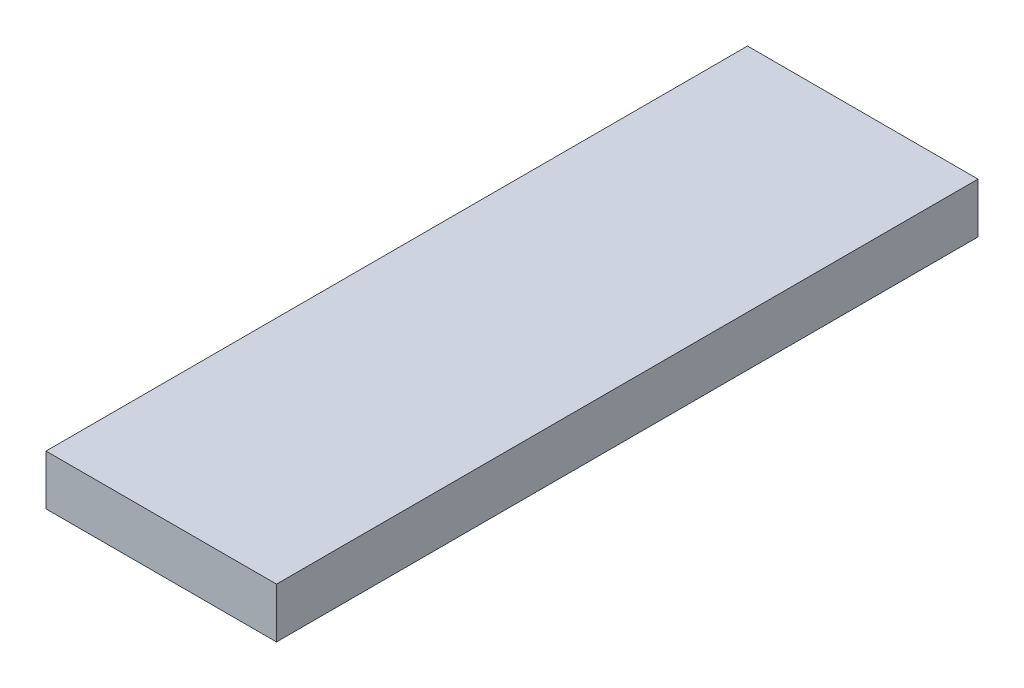
ISO-10303-21;
HEADER;
FILE_DESCRIPTION(('STEP AP214'),'2;1');
FILE_NAME('part.step','',(''),(''),'','','');
FILE_SCHEMA(('AUTOMOTIVE_DESIGN { 1 0 10303 214 1 1 1 1 }'));
ENDSEC;
DATA;
#1=APPLICATION_CONTEXT('core data for automotive mechanical design processes');
#2=APPLICATION_PROTOCOL_DEFINITION('international standard','automotive_design',2000,#1);
#3=PRODUCT_CONTEXT('',#1,'mechanical');
#4=PRODUCT('Part','Part','',(#3));
#5=PRODUCT_RELATED_PRODUCT_CATEGORY('part','',(#4));
#6=PRODUCT_DEFINITION_FORMATION('','',#4);
#7=PRODUCT_DEFINITION_CONTEXT('part definition',#1,'design');
#8=PRODUCT_DEFINITION('design','',#6,#7);
#9=PRODUCT_DEFINITION_SHAPE('','',#8);
#10=(LENGTH_UNIT() NAMED_UNIT(*) SI_UNIT(.MILLI.,.METRE.));
#11=(NAMED_UNIT(*) PLANE_ANGLE_UNIT() SI_UNIT($,.RADIAN.));
#12=(NAMED_UNIT(*) SI_UNIT($,.STERADIAN.) SOLID_ANGLE_UNIT());
#13=UNCERTAINTY_MEASURE_WITH_UNIT(LENGTH_MEASURE(1.E-05),#10,'distance_accuracy_value','');
#14=(GEOMETRIC_REPRESENTATION_CONTEXT(3) GLOBAL_UNCERTAINTY_ASSIGNED_CONTEXT((#13)) GLOBAL_UNIT_ASSIGNED_CONTEXT((#10,
#11,#12)) REPRESENTATION_CONTEXT('',''));
#15=CARTESIAN_POINT('',(0.,0.,0.));
#16=DIRECTION('',(0.,0.,1.));
#17=DIRECTION('',(1.,0.,0.));
#18=AXIS2_PLACEMENT_3D('',#15,#16,#17);
#19=CARTESIAN_POINT('',(11.5,5.,-35.));
#20=DIRECTION('',(-1.,0.,0.));
#21=DIRECTION('',(0.,0.,1.));
#22=AXIS2_PLACEMENT_3D('',#19,#20,#21);
#23=PLANE('',#22);
#24=DIRECTION('',(0.,0.,-1.));
#25=VECTOR('',#24,1.);
#26=CARTESIAN_POINT('',(11.5,0.,-35.));
#27=LINE('',#26,#25);
#28=CARTESIAN_POINT('',(11.5,0.,35.));
#29=VERTEX_POINT('',#28);
#30=CARTESIAN_POINT('',(11.5,0.,-35.));
#31=VERTEX_POINT('',#30);
#32=EDGE_CURVE('E104',#29,#31,#27,.T.);
#33=ORIENTED_EDGE('',*,*,#32,.T.);
#34=DIRECTION('',(0.,-1.,0.));
#35=VECTOR('',#34,1.);
#36=CARTESIAN_POINT('',(11.5,5.,-35.));
#37=LINE('',#36,#35);
#38=CARTESIAN_POINT('',(11.5,5.,-35.));
#39=VERTEX_POINT('',#38);
#40=EDGE_CURVE('E11',#39,#31,#37,.T.);
#41=ORIENTED_EDGE('',*,*,#40,.F.);
#42=DIRECTION('',(0.,0.,-1.));
#43=VECTOR('',#42,1.);
#44=CARTESIAN_POINT('',(11.5,5.,-35.));
#45=LINE('',#44,#43);
#46=CARTESIAN_POINT('',(11.5,5.,35.));
#47=VERTEX_POINT('',#46);
#48=EDGE_CURVE('E92',#47,#39,#45,.T.);
#49=ORIENTED_EDGE('',*,*,#48,.F.);
#50=DIRECTION('',(0.,-1.,0.));
#51=VECTOR('',#50,1.);
#52=CARTESIAN_POINT('',(11.5,5.,35.));
#53=LINE('',#52,#51);
#54=EDGE_CURVE('E100',#47,#29,#53,.T.);
#55=ORIENTED_EDGE('',*,*,#54,.T.);
#56=EDGE_LOOP('',(#33,#41,#49,#55));
#57=FACE_BOUND('',#56,.T.);
#58=ADVANCED_FACE('F41',(#57),#23,.F.);
#59=CARTESIAN_POINT('',(-11.5,5.,-35.));
#60=DIRECTION('',(0.,0.,1.));
#61=DIRECTION('',(1.,0.,0.));
#62=AXIS2_PLACEMENT_3D('',#59,#60,#61);
#63=PLANE('',#62);
#64=DIRECTION('',(-1.,0.,0.));
#65=VECTOR('',#64,1.);
#66=CARTESIAN_POINT('',(-11.5,0.,-35.));
#67=LINE('',#66,#65);
#68=CARTESIAN_POINT('',(-11.5,0.,-35.));
#69=VERTEX_POINT('',#68);
#70=EDGE_CURVE('E96',#31,#69,#67,.T.);
#71=ORIENTED_EDGE('',*,*,#70,.T.);
#72=DIRECTION('',(0.,-1.,0.));
#73=VECTOR('',#72,1.);
#74=CARTESIAN_POINT('',(-11.5,5.,-35.));
#75=LINE('',#74,#73);
#76=CARTESIAN_POINT('',(-11.5,5.,-35.));
#77=VERTEX_POINT('',#76);
#78=EDGE_CURVE('E49',#77,#69,#75,.T.);
#79=ORIENTED_EDGE('',*,*,#78,.F.);
#80=DIRECTION('',(-1.,0.,0.));
#81=VECTOR('',#80,1.);
#82=CARTESIAN_POINT('',(-11.5,5.,-35.));
#83=LINE('',#82,#81);
#84=EDGE_CURVE('E87',#39,#77,#83,.T.);
#85=ORIENTED_EDGE('',*,*,#84,.F.);
#86=ORIENTED_EDGE('',*,*,#40,.T.);
#87=EDGE_LOOP('',(#71,#79,#85,#86));
#88=FACE_BOUND('',#87,.T.);
#89=ADVANCED_FACE('F95',(#88),#63,.F.);
#90=CARTESIAN_POINT('',(-11.5,5.,-35.));
#91=DIRECTION('',(1.,0.,0.));
#92=DIRECTION('',(0.,0.,-1.));
#93=AXIS2_PLACEMENT_3D('',#90,#91,#92);
#94=PLANE('',#93);
#95=DIRECTION('',(0.,0.,1.));
#96=VECTOR('',#95,1.);
#97=CARTESIAN_POINT('',(-11.5,0.,-35.));
#98=LINE('',#97,#96);
#99=CARTESIAN_POINT('',(-11.5,0.,35.));
#100=VERTEX_POINT('',#99);
#101=EDGE_CURVE('E74',#69,#100,#98,.T.);
#102=ORIENTED_EDGE('',*,*,#101,.T.);
#103=DIRECTION('',(0.,-1.,0.));
#104=VECTOR('',#103,1.);
#105=CARTESIAN_POINT('',(-11.5,5.,35.));
#106=LINE('',#105,#104);
#107=CARTESIAN_POINT('',(-11.5,5.,35.));
#108=VERTEX_POINT('',#107);
#109=EDGE_CURVE('E97',#108,#100,#106,.T.);
#110=ORIENTED_EDGE('',*,*,#109,.F.);
#111=DIRECTION('',(0.,0.,1.));
#112=VECTOR('',#111,1.);
#113=CARTESIAN_POINT('',(-11.5,5.,-35.));
#114=LINE('',#113,#112);
#115=EDGE_CURVE('E90',#77,#108,#114,.T.);
#116=ORIENTED_EDGE('',*,*,#115,.F.);
#117=ORIENTED_EDGE('',*,*,#78,.T.);
#118=EDGE_LOOP('',(#102,#110,#116,#117));
#119=FACE_BOUND('',#118,.T.);
#120=ADVANCED_FACE('F98',(#119),#94,.F.);
#121=CARTESIAN_POINT('',(-11.5,5.,35.));
#122=DIRECTION('',(0.,0.,-1.));
#123=DIRECTION('',(-1.,0.,0.));
#124=AXIS2_PLACEMENT_3D('',#121,#122,#123);
#125=PLANE('',#124);
#126=DIRECTION('',(1.,0.,0.));
#127=VECTOR('',#126,1.);
#128=CARTESIAN_POINT('',(-11.5,0.,35.));
#129=LINE('',#128,#127);
#130=EDGE_CURVE('E80',#100,#29,#129,.T.);
#131=ORIENTED_EDGE('',*,*,#130,.T.);
#132=ORIENTED_EDGE('',*,*,#54,.F.);
#133=DIRECTION('',(1.,0.,0.));
#134=VECTOR('',#133,1.);
#135=CARTESIAN_POINT('',(-11.5,5.,35.));
#136=LINE('',#135,#134);
#137=EDGE_CURVE('E57',#108,#47,#136,.T.);
#138=ORIENTED_EDGE('',*,*,#137,.F.);
#139=ORIENTED_EDGE('',*,*,#109,.T.);
#140=EDGE_LOOP('',(#131,#132,#138,#139));
#141=FACE_BOUND('',#140,.T.);
#142=ADVANCED_FACE('F111',(#141),#125,.F.);
#143=CARTESIAN_POINT('',(0.,5.,0.));
#144=DIRECTION('',(0.,1.,0.));
#145=DIRECTION('',(0.,0.,1.));
#146=AXIS2_PLACEMENT_3D('',#143,#144,#145);
#147=PLANE('',#146);
#148=ORIENTED_EDGE('',*,*,#48,.T.);
#149=ORIENTED_EDGE('',*,*,#84,.T.);
#150=ORIENTED_EDGE('',*,*,#115,.T.);
#151=ORIENTED_EDGE('',*,*,#137,.T.);
#152=EDGE_LOOP('',(#148,#149,#150,#151));
#153=FACE_BOUND('',#152,.T.);
#154=ADVANCED_FACE('F88',(#153),#147,.T.);
#155=CARTESIAN_POINT('',(0.,0.,0.));
#156=DIRECTION('',(0.,1.,0.));
#157=DIRECTION('',(0.,0.,1.));
#158=AXIS2_PLACEMENT_3D('',#155,#156,#157);
#159=PLANE('',#158);
#160=ORIENTED_EDGE('',*,*,#32,.F.);
#161=ORIENTED_EDGE('',*,*,#130,.F.);
#162=ORIENTED_EDGE('',*,*,#101,.F.);
#163=ORIENTED_EDGE('',*,*,#70,.F.);
#164=EDGE_LOOP('',(#160,#161,#162,#163));
#165=FACE_BOUND('',#164,.T.);
#166=ADVANCED_FACE('F114',(#165),#159,.F.);
#167=CLOSED_SHELL('',(#58,#89,#120,#142,#154,#166));
#168=MANIFOLD_SOLID_BREP('B2',#167);
#169=ADVANCED_BREP_SHAPE_REPRESENTATION('',(#18,#168),#14);
#170=SHAPE_DEFINITION_REPRESENTATION(#9,#169);
ENDSEC;
END-ISO-10303-21;
